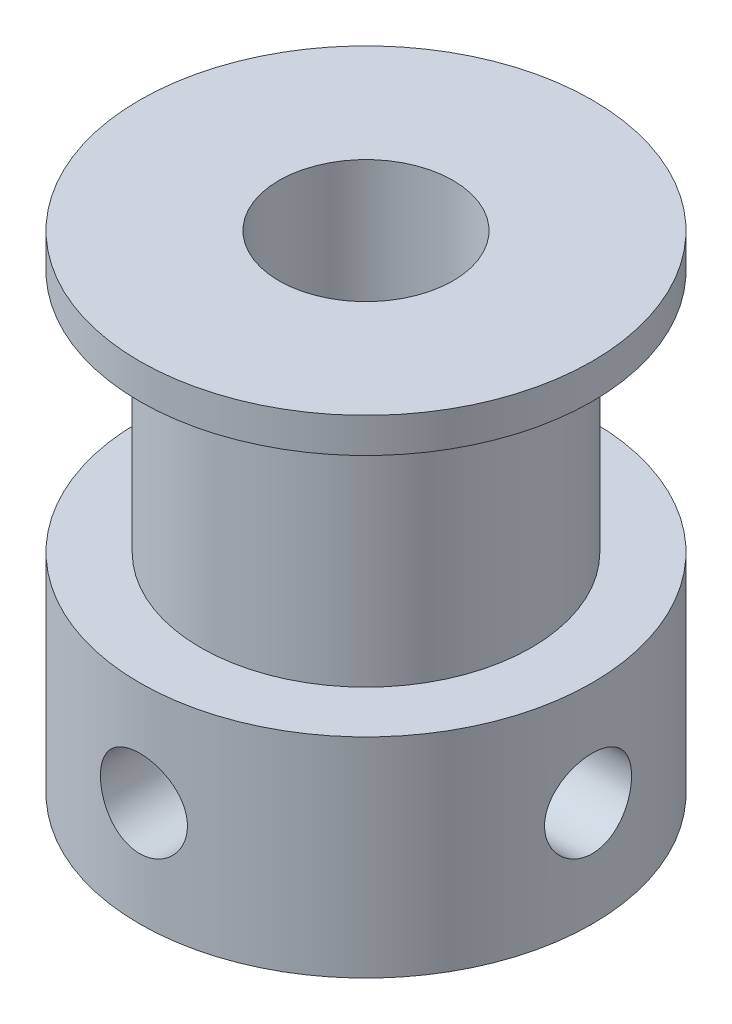
ISO-10303-21;
HEADER;
FILE_DESCRIPTION(('STEP AP214'),'2;1');
FILE_NAME('part.step','',(''),(''),'','','');
FILE_SCHEMA(('AUTOMOTIVE_DESIGN { 1 0 10303 214 1 1 1 1 }'));
ENDSEC;
DATA;
#1=APPLICATION_CONTEXT('core data for automotive mechanical design processes');
#2=APPLICATION_PROTOCOL_DEFINITION('international standard','automotive_design',2000,#1);
#3=PRODUCT_CONTEXT('',#1,'mechanical');
#4=PRODUCT('Part','Part','',(#3));
#5=PRODUCT_RELATED_PRODUCT_CATEGORY('part','',(#4));
#6=PRODUCT_DEFINITION_FORMATION('','',#4);
#7=PRODUCT_DEFINITION_CONTEXT('part definition',#1,'design');
#8=PRODUCT_DEFINITION('design','',#6,#7);
#9=PRODUCT_DEFINITION_SHAPE('','',#8);
#10=(LENGTH_UNIT() NAMED_UNIT(*) SI_UNIT(.MILLI.,.METRE.));
#11=(NAMED_UNIT(*) PLANE_ANGLE_UNIT() SI_UNIT($,.RADIAN.));
#12=(NAMED_UNIT(*) SI_UNIT($,.STERADIAN.) SOLID_ANGLE_UNIT());
#13=UNCERTAINTY_MEASURE_WITH_UNIT(LENGTH_MEASURE(1.E-05),#10,'distance_accuracy_value','');
#14=(GEOMETRIC_REPRESENTATION_CONTEXT(3) GLOBAL_UNCERTAINTY_ASSIGNED_CONTEXT((#13)) GLOBAL_UNIT_ASSIGNED_CONTEXT((#10,
#11,#12)) REPRESENTATION_CONTEXT('',''));
#15=CARTESIAN_POINT('',(0.,0.,0.));
#16=DIRECTION('',(0.,0.,1.));
#17=DIRECTION('',(1.,0.,0.));
#18=AXIS2_PLACEMENT_3D('',#15,#16,#17);
#19=CARTESIAN_POINT('',(0.,0.,0.));
#20=DIRECTION('',(0.,-1.,0.));
#21=DIRECTION('',(0.,0.,-1.));
#22=AXIS2_PLACEMENT_3D('',#19,#20,#21);
#23=CYLINDRICAL_SURFACE('',#22,2.5);
#24=CARTESIAN_POINT('',(2.1650635094611,3.,1.24999999999999));
#25=CARTESIAN_POINT('',(2.16506918410574,3.06513476024406,1.24999545384316));
#26=CARTESIAN_POINT('',(2.16804751484696,3.13035176440631,1.24487496341651));
#27=CARTESIAN_POINT('',(2.17952958065066,3.25878408084644,1.22465401237256));
#28=CARTESIAN_POINT('',(2.1880449256945,3.32199489380426,1.20953258069272));
#29=CARTESIAN_POINT('',(2.20936683256748,3.44431458042992,1.17012493587476));
#30=CARTESIAN_POINT('',(2.22215054341565,3.50344331559198,1.14588744061716));
#31=CARTESIAN_POINT('',(2.25053331021073,3.6167802524959,1.08908440672046));
#32=CARTESIAN_POINT('',(2.26613251845081,3.67098818782807,1.05651841754471));
#33=CARTESIAN_POINT('',(2.29996086321802,3.77788216069688,0.980833175663592));
#34=CARTESIAN_POINT('',(2.31830079547442,3.83007391959193,0.937065045179707));
#35=CARTESIAN_POINT('',(2.35464978482132,3.92676048550838,0.84156725951808));
#36=CARTESIAN_POINT('',(2.37265867289063,3.9712514532294,0.789833657227861));
#37=CARTESIAN_POINT('',(2.40776846191186,4.05420893893457,0.675611954268178));
#38=CARTESIAN_POINT('',(2.42472633022716,4.09206720982441,0.612633986265714));
#39=CARTESIAN_POINT('',(2.45438445124411,4.1564260665572,0.480196283249376));
#40=CARTESIAN_POINT('',(2.46708738979677,4.18293382017146,0.410740672672691));
#41=CARTESIAN_POINT('',(2.48600576555297,4.22188082662637,0.272556179907469));
#42=CARTESIAN_POINT('',(2.49261850276115,4.23518690794441,0.20412723811102));
#43=CARTESIAN_POINT('',(2.50009479807584,4.25020764834379,0.065713285872309));
#44=CARTESIAN_POINT('',(2.50096183480737,4.25192932099463,-0.00427075730467387));
#45=CARTESIAN_POINT('',(2.49703727395563,4.24406665753706,-0.137290655529687));
#46=CARTESIAN_POINT('',(2.49273119865201,4.23545248059847,-0.200401498970989));
#47=CARTESIAN_POINT('',(2.47967806574684,4.20889894511917,-0.324142214897902));
#48=CARTESIAN_POINT('',(2.47093067582992,4.19095888877971,-0.384771901367406));
#49=CARTESIAN_POINT('',(2.44964479109568,4.14614679238773,-0.50288673946194));
#50=CARTESIAN_POINT('',(2.43705551911499,4.11915460853491,-0.560316779393971));
#51=CARTESIAN_POINT('',(2.40922057483359,4.05717072974813,-0.669971001891658));
#52=CARTESIAN_POINT('',(2.39397395196855,4.02217617087206,-0.722193311048304));
#53=CARTESIAN_POINT('',(2.36055492999037,3.94138081058372,-0.82521707612274));
#54=CARTESIAN_POINT('',(2.34224219997719,3.89487121459248,-0.875417593786697));
#55=CARTESIAN_POINT('',(2.30567925733515,3.79426284383727,-0.967630462872221));
#56=CARTESIAN_POINT('',(2.28742910332036,3.74015828465742,-1.00963651446778));
#57=CARTESIAN_POINT('',(2.25180195115606,3.62168975946989,-1.08688166830276));
#58=CARTESIAN_POINT('',(2.23455399988385,3.55689247118223,-1.12152164372256));
#59=CARTESIAN_POINT('',(2.2046931284822,3.42132791080125,-1.17914889125153));
#60=CARTESIAN_POINT('',(2.19207537557585,3.35056695872804,-1.20214832276361));
#61=CARTESIAN_POINT('',(2.17430794771293,3.21098186089651,-1.23397526378129));
#62=CARTESIAN_POINT('',(2.16864569810621,3.14244860119556,-1.24378140264996));
#63=CARTESIAN_POINT('',(2.16397399202012,3.00449832310432,-1.25189618326428));
#64=CARTESIAN_POINT('',(2.1649598361164,2.93508196360026,-1.25021294664377));
#65=CARTESIAN_POINT('',(2.17292920675732,2.80543260177659,-1.23629505417995));
#66=CARTESIAN_POINT('',(2.17924484383318,2.74502568611509,-1.22523477089058));
#67=CARTESIAN_POINT('',(2.19617526939177,2.6270402671613,-1.19462035579054));
#68=CARTESIAN_POINT('',(2.20679145006293,2.56946268656674,-1.17506347327951));
#69=CARTESIAN_POINT('',(2.23170277599571,2.45573583637163,-1.1270594857561));
#70=CARTESIAN_POINT('',(2.24614554053829,2.39977622893306,-1.0982425796159));
#71=CARTESIAN_POINT('',(2.27695149371562,2.29316341057626,-1.03285883001975));
#72=CARTESIAN_POINT('',(2.29331566693935,2.2425129456084,-0.996288005415263));
#73=CARTESIAN_POINT('',(2.3285999807042,2.14127654059557,-0.91104645899856));
#74=CARTESIAN_POINT('',(2.34758228942862,2.09150356160293,-0.861431590393701));
#75=CARTESIAN_POINT('',(2.38417793722366,2.00073470250802,-0.754255619247854));
#76=CARTESIAN_POINT('',(2.40179081259637,1.95974178721183,-0.696691843319177));
#77=CARTESIAN_POINT('',(2.43426702113696,1.88678284256238,-0.57316920319844));
#78=CARTESIAN_POINT('',(2.44904552090037,1.85508360223637,-0.507028871967635));
#79=CARTESIAN_POINT('',(2.47354193699126,1.80357762017827,-0.369402955801347));
#80=CARTESIAN_POINT('',(2.48326429595466,1.78376043579213,-0.297922126740215));
#81=CARTESIAN_POINT('',(2.49584385227353,1.75828929478168,-0.158724602913017));
#82=CARTESIAN_POINT('',(2.49924909885239,1.75150265515486,-0.0912643048130678));
#83=CARTESIAN_POINT('',(2.50052662968914,1.74894591818201,0.0439074824390071));
#84=CARTESIAN_POINT('',(2.49840085083612,1.75317196434555,0.111618875368861));
#85=CARTESIAN_POINT('',(2.48917461047403,1.77177050849454,0.240672490396435));
#86=CARTESIAN_POINT('',(2.48241118334987,1.7854560615721,0.302140397264081));
#87=CARTESIAN_POINT('',(2.46490117079279,1.82165874912872,0.421807440229522));
#88=CARTESIAN_POINT('',(2.45415401415995,1.84417715011682,0.480006106194386));
#89=CARTESIAN_POINT('',(2.4290741343515,1.89840881520747,0.594279257806105));
#90=CARTESIAN_POINT('',(2.41460771498499,1.93047415400981,0.650156428375057));
#91=CARTESIAN_POINT('',(2.38360166427283,2.00244741357382,0.75596830226753));
#92=CARTESIAN_POINT('',(2.36706108197951,2.0423589363946,0.805900259268632));
#93=CARTESIAN_POINT('',(2.33160762783285,2.13349642377839,0.903642505196112));
#94=CARTESIAN_POINT('',(2.31262248764623,2.1854531093465,0.950747105674087));
#95=CARTESIAN_POINT('',(2.27578845203566,2.29681340141222,1.03582910924334));
#96=CARTESIAN_POINT('',(2.25794057202332,2.35622352608461,1.07379843751257));
#97=CARTESIAN_POINT('',(2.22499506631145,2.4832958082262,1.14053884973206));
#98=CARTESIAN_POINT('',(2.21000217820338,2.55115941391093,1.16898133245117));
#99=CARTESIAN_POINT('',(2.1858269541044,2.69166550542473,1.21359838688301));
#100=CARTESIAN_POINT('',(2.17662520184628,2.76429111114086,1.22981398896918));
#101=CARTESIAN_POINT('',(2.16911590752239,2.864756694565,1.24295875983051));
#102=CARTESIAN_POINT('',(2.1676016125644,2.89170986799736,1.24559513120481));
#103=CARTESIAN_POINT('',(2.16557419859688,2.94577060085281,1.24911675636245));
#104=CARTESIAN_POINT('',(2.16506114656387,2.97287817048234,1.25000189299983));
#105=CARTESIAN_POINT('',(2.1650635094611,3.,1.24999999999999));
#106=B_SPLINE_CURVE_WITH_KNOTS('',3,(#24,#25,#26,#27,#28,#29,#30,#31,#32,#33,#34,#35,#36,#37,
#38,#39,#40,#41,#42,#43,#44,#45,#46,#47,#48,#49,#50,#51,#52,#53,#54,#55,#56,#57,#58,#59,#60,#61,
#62,#63,#64,#65,#66,#67,#68,#69,#70,#71,#72,#73,#74,#75,#76,#77,#78,#79,#80,#81,#82,#83,#84,#85,
#86,#87,#88,#89,#90,#91,#92,#93,#94,#95,#96,#97,#98,#99,#100,#101,#102,#103,#104,#105),
.UNSPECIFIED.,.T.,.F.,(4,2,2,2,2,2,2,2,2,2,2,2,2,2,2,2,2,2,2,2,2,2,2,2,2,2,2,2,2,2,2,2,2,2,2,2,
2,2,2,2,4),(0.,0.195290153243393,0.390991116031004,0.585660744898605,0.780340906806434,
0.991077890622787,1.20191963855463,1.42697365298454,1.65188533704863,1.86079356209918,
2.06957529607549,2.26020121855672,2.45084140646818,2.64411918413932,2.83746624187838,
3.04908989321112,3.26087560307396,3.48611052161809,3.71110967764629,3.91827863567763,
4.12530116485464,4.30967729280029,4.49411315545076,4.68709120507607,4.88016857775056,
5.09758429475764,5.3150733122275,5.53830226766204,5.76133474760961,5.96390337986855,
6.16640108492461,6.35555531089362,6.54473666890012,6.74200938399336,6.93937287625895,
7.1563780231258,7.37357428556439,7.59763436298252,7.82093916253446,7.90225168981632,
7.98356965618171),.UNSPECIFIED.);
#107=CARTESIAN_POINT('',(2.1650635094611,3.,1.24999999999999));
#108=VERTEX_POINT('',#107);
#109=EDGE_CURVE('E83',#108,#108,#106,.T.);
#110=ORIENTED_EDGE('',*,*,#109,.F.);
#111=EDGE_LOOP('',(#110));
#112=FACE_BOUND('',#111,.T.);
#113=CARTESIAN_POINT('',(-1.25,3.,2.1650635094611));
#114=CARTESIAN_POINT('',(-1.24999545384316,3.06513476024406,2.16506918410574));
#115=CARTESIAN_POINT('',(-1.24487496341652,3.13035176440631,2.16804751484696));
#116=CARTESIAN_POINT('',(-1.22465401237257,3.25878408084644,2.17952958065066));
#117=CARTESIAN_POINT('',(-1.20953258069272,3.32199489380426,2.18804492569449));
#118=CARTESIAN_POINT('',(-1.17012493587476,3.44431458042993,2.20936683256748));
#119=CARTESIAN_POINT('',(-1.14588744061716,3.50344331559198,2.22215054341565));
#120=CARTESIAN_POINT('',(-1.08908440672046,3.6167802524959,2.25053331021072));
#121=CARTESIAN_POINT('',(-1.05651841754472,3.67098818782807,2.26613251845081));
#122=CARTESIAN_POINT('',(-0.980833175663597,3.77788216069688,2.29996086321802));
#123=CARTESIAN_POINT('',(-0.937065045179712,3.83007391959193,2.31830079547442));
#124=CARTESIAN_POINT('',(-0.841567259518084,3.92676048550839,2.35464978482132));
#125=CARTESIAN_POINT('',(-0.789833657227865,3.9712514532294,2.37265867289062));
#126=CARTESIAN_POINT('',(-0.675611954268182,4.05420893893458,2.40776846191186));
#127=CARTESIAN_POINT('',(-0.612633986265718,4.09206720982441,2.42472633022716));
#128=CARTESIAN_POINT('',(-0.48019628324938,4.1564260665572,2.45438445124411));
#129=CARTESIAN_POINT('',(-0.410740672672693,4.18293382017146,2.46708738979677));
#130=CARTESIAN_POINT('',(-0.272556179907471,4.22188082662637,2.48600576555297));
#131=CARTESIAN_POINT('',(-0.204127238111021,4.23518690794442,2.49261850276115));
#132=CARTESIAN_POINT('',(-0.06571328587231,4.2502076483438,2.50009479807584));
#133=CARTESIAN_POINT('',(0.00427075730467308,4.25192932099464,2.50096183480737));
#134=CARTESIAN_POINT('',(0.137290655529687,4.24406665753706,2.49703727395563));
#135=CARTESIAN_POINT('',(0.200401498970989,4.23545248059847,2.49273119865201));
#136=CARTESIAN_POINT('',(0.324142214897902,4.20889894511918,2.47967806574684));
#137=CARTESIAN_POINT('',(0.384771901367406,4.19095888877972,2.47093067582992));
#138=CARTESIAN_POINT('',(0.502886739461941,4.14614679238773,2.44964479109568));
#139=CARTESIAN_POINT('',(0.560316779393972,4.11915460853491,2.43705551911499));
#140=CARTESIAN_POINT('',(0.66997100189166,4.05717072974813,2.40922057483359));
#141=CARTESIAN_POINT('',(0.722193311048306,4.02217617087206,2.39397395196855));
#142=CARTESIAN_POINT('',(0.825217076122743,3.94138081058373,2.36055492999037));
#143=CARTESIAN_POINT('',(0.8754175937867,3.89487121459249,2.34224219997719));
#144=CARTESIAN_POINT('',(0.967630462872224,3.79426284383728,2.30567925733515));
#145=CARTESIAN_POINT('',(1.00963651446779,3.74015828465742,2.28742910332036));
#146=CARTESIAN_POINT('',(1.08688166830276,3.62168975946989,2.25180195115606));
#147=CARTESIAN_POINT('',(1.12152164372256,3.55689247118224,2.23455399988385));
#148=CARTESIAN_POINT('',(1.17914889125154,3.42132791080125,2.2046931284822));
#149=CARTESIAN_POINT('',(1.20214832276361,3.35056695872805,2.19207537557584));
#150=CARTESIAN_POINT('',(1.2339752637813,3.21098186089651,2.17430794771293));
#151=CARTESIAN_POINT('',(1.24378140264997,3.14244860119556,2.16864569810621));
#152=CARTESIAN_POINT('',(1.25189618326428,3.00449832310432,2.16397399202012));
#153=CARTESIAN_POINT('',(1.25021294664378,2.93508196360027,2.1649598361164));
#154=CARTESIAN_POINT('',(1.23629505417996,2.80543260177659,2.17292920675731));
#155=CARTESIAN_POINT('',(1.22523477089058,2.74502568611509,2.17924484383318));
#156=CARTESIAN_POINT('',(1.19462035579055,2.6270402671613,2.19617526939176));
#157=CARTESIAN_POINT('',(1.17506347327952,2.56946268656674,2.20679145006292));
#158=CARTESIAN_POINT('',(1.12705948575611,2.45573583637163,2.23170277599571));
#159=CARTESIAN_POINT('',(1.0982425796159,2.39977622893306,2.24614554053829));
#160=CARTESIAN_POINT('',(1.03285883001975,2.29316341057626,2.27695149371562));
#161=CARTESIAN_POINT('',(0.996288005415269,2.2425129456084,2.29331566693935));
#162=CARTESIAN_POINT('',(0.911046458998566,2.14127654059557,2.3285999807042));
#163=CARTESIAN_POINT('',(0.861431590393707,2.09150356160293,2.34758228942861));
#164=CARTESIAN_POINT('',(0.75425561924786,2.00073470250801,2.38417793722366));
#165=CARTESIAN_POINT('',(0.696691843319183,1.95974178721183,2.40179081259637));
#166=CARTESIAN_POINT('',(0.573169203198446,1.88678284256237,2.43426702113696));
#167=CARTESIAN_POINT('',(0.507028871967641,1.85508360223636,2.44904552090037));
#168=CARTESIAN_POINT('',(0.369402955801352,1.80357762017826,2.47354193699126));
#169=CARTESIAN_POINT('',(0.297922126740219,1.78376043579212,2.48326429595466));
#170=CARTESIAN_POINT('',(0.158724602913021,1.75828929478167,2.49584385227353));
#171=CARTESIAN_POINT('',(0.0912643048130706,1.75150265515486,2.49924909885239));
#172=CARTESIAN_POINT('',(-0.043907482439005,1.748945918182,2.50052662968914));
#173=CARTESIAN_POINT('',(-0.111618875368859,1.75317196434555,2.49840085083612));
#174=CARTESIAN_POINT('',(-0.240672490396434,1.77177050849453,2.48917461047403));
#175=CARTESIAN_POINT('',(-0.30214039726408,1.78545606157209,2.48241118334987));
#176=CARTESIAN_POINT('',(-0.421807440229522,1.82165874912872,2.46490117079279));
#177=CARTESIAN_POINT('',(-0.480006106194386,1.84417715011682,2.45415401415995));
#178=CARTESIAN_POINT('',(-0.594279257806106,1.89840881520747,2.4290741343515));
#179=CARTESIAN_POINT('',(-0.650156428375057,1.9304741540098,2.41460771498499));
#180=CARTESIAN_POINT('',(-0.75596830226753,2.00244741357381,2.38360166427283));
#181=CARTESIAN_POINT('',(-0.805900259268633,2.04235893639459,2.36706108197951));
#182=CARTESIAN_POINT('',(-0.903642505196114,2.13349642377838,2.33160762783285));
#183=CARTESIAN_POINT('',(-0.950747105674089,2.18545310934649,2.31262248764622));
#184=CARTESIAN_POINT('',(-1.03582910924334,2.29681340141221,2.27578845203566));
#185=CARTESIAN_POINT('',(-1.07379843751257,2.35622352608461,2.25794057202332));
#186=CARTESIAN_POINT('',(-1.14053884973207,2.4832958082262,2.22499506631145));
#187=CARTESIAN_POINT('',(-1.16898133245117,2.55115941391092,2.21000217820338));
#188=CARTESIAN_POINT('',(-1.21359838688301,2.69166550542472,2.1858269541044));
#189=CARTESIAN_POINT('',(-1.22981398896918,2.76429111114086,2.17662520184628));
#190=CARTESIAN_POINT('',(-1.24295875983052,2.864756694565,2.16911590752238));
#191=CARTESIAN_POINT('',(-1.24559513120481,2.89170986799735,2.1676016125644));
#192=CARTESIAN_POINT('',(-1.24911675636245,2.9457706008528,2.16557419859688));
#193=CARTESIAN_POINT('',(-1.25000189299984,2.97287817048234,2.16506114656387));
#194=CARTESIAN_POINT('',(-1.25,3.,2.1650635094611));
#195=B_SPLINE_CURVE_WITH_KNOTS('',3,(#113,#114,#115,#116,#117,#118,#119,#120,#121,#122,#123,
#124,#125,#126,#127,#128,#129,#130,#131,#132,#133,#134,#135,#136,#137,#138,#139,#140,#141,#142,
#143,#144,#145,#146,#147,#148,#149,#150,#151,#152,#153,#154,#155,#156,#157,#158,#159,#160,#161,
#162,#163,#164,#165,#166,#167,#168,#169,#170,#171,#172,#173,#174,#175,#176,#177,#178,#179,#180,
#181,#182,#183,#184,#185,#186,#187,#188,#189,#190,#191,#192,#193,#194),.UNSPECIFIED.,.T.,.F.,(4,
2,2,2,2,2,2,2,2,2,2,2,2,2,2,2,2,2,2,2,2,2,2,2,2,2,2,2,2,2,2,2,2,2,2,2,2,2,2,2,4),(0.,
0.195290153243394,0.390991116031005,0.585660744898607,0.780340906806436,0.991077890622791,
1.20191963855464,1.42697365298454,1.65188533704864,1.86079356209919,2.0695752960755,
2.26020121855673,2.45084140646819,2.64411918413933,2.8374662418784,3.04908989321113,
3.26087560307398,3.4861105216181,3.71110967764631,3.91827863567764,4.12530116485466,
4.30967729280031,4.49411315545078,4.68709120507609,4.88016857775059,5.09758429475766,
5.31507331222752,5.53830226766207,5.76133474760964,5.96390337986858,6.16640108492464,
6.35555531089365,6.54473666890016,6.74200938399339,6.93937287625898,7.15637802312583,
7.37357428556442,7.59763436298255,7.8209391625345,7.90225168981636,7.98356965618175),.UNSPECIFIED.);
#196=CARTESIAN_POINT('',(-1.25,3.,2.1650635094611));
#197=VERTEX_POINT('',#196);
#198=EDGE_CURVE('E75',#197,#197,#195,.T.);
#199=ORIENTED_EDGE('',*,*,#198,.F.);
#200=EDGE_LOOP('',(#199));
#201=FACE_BOUND('',#200,.T.);
#202=CARTESIAN_POINT('',(0.,0.,0.));
#203=DIRECTION('',(0.,-1.,0.));
#204=DIRECTION('',(0.,0.,-1.));
#205=AXIS2_PLACEMENT_3D('',#202,#203,#204);
#206=CIRCLE('',#205,2.5);
#207=CARTESIAN_POINT('',(0.,0.,-2.5));
#208=VERTEX_POINT('',#207);
#209=EDGE_CURVE('E50',#208,#208,#206,.T.);
#210=ORIENTED_EDGE('',*,*,#209,.T.);
#211=EDGE_LOOP('',(#210));
#212=FACE_BOUND('',#211,.T.);
#213=CARTESIAN_POINT('',(0.,14.,0.));
#214=DIRECTION('',(0.,-1.,0.));
#215=DIRECTION('',(0.,0.,-1.));
#216=AXIS2_PLACEMENT_3D('',#213,#214,#215);
#217=CIRCLE('',#216,2.5);
#218=CARTESIAN_POINT('',(0.,14.,-2.5));
#219=VERTEX_POINT('',#218);
#220=EDGE_CURVE('E82',#219,#219,#217,.T.);
#221=ORIENTED_EDGE('',*,*,#220,.F.);
#222=EDGE_LOOP('',(#221));
#223=FACE_BOUND('',#222,.T.);
#224=ADVANCED_FACE('F34',(#112,#201,#212,#223),#23,.F.);
#225=CARTESIAN_POINT('',(2.5,0.,0.));
#226=DIRECTION('',(0.,-1.,0.));
#227=DIRECTION('',(0.,0.,-1.));
#228=AXIS2_PLACEMENT_3D('',#225,#226,#227);
#229=PLANE('',#228);
#230=CARTESIAN_POINT('',(0.,0.,0.));
#231=DIRECTION('',(0.,-1.,0.));
#232=DIRECTION('',(0.,0.,-1.));
#233=AXIS2_PLACEMENT_3D('',#230,#231,#232);
#234=CIRCLE('',#233,6.5);
#235=CARTESIAN_POINT('',(0.,0.,-6.5));
#236=VERTEX_POINT('',#235);
#237=EDGE_CURVE('E54',#236,#236,#234,.T.);
#238=ORIENTED_EDGE('',*,*,#237,.T.);
#239=EDGE_LOOP('',(#238));
#240=FACE_BOUND('',#239,.T.);
#241=ORIENTED_EDGE('',*,*,#209,.F.);
#242=EDGE_LOOP('',(#241));
#243=FACE_BOUND('',#242,.T.);
#244=ADVANCED_FACE('F106',(#240,#243),#229,.T.);
#245=CARTESIAN_POINT('',(0.,0.,0.));
#246=DIRECTION('',(0.,-1.,0.));
#247=DIRECTION('',(0.,0.,-1.));
#248=AXIS2_PLACEMENT_3D('',#245,#246,#247);
#249=CYLINDRICAL_SURFACE('',#248,6.5);
#250=CARTESIAN_POINT('',(6.5,1.75000000000001,0.));
#251=CARTESIAN_POINT('',(6.49999873054918,1.75000262060986,-0.0695263300903764));
#252=CARTESIAN_POINT('',(6.49887299034978,1.755820293649,-0.139086386536077));
#253=CARTESIAN_POINT('',(6.49449072478032,1.77892097243112,-0.276244066545679));
#254=CARTESIAN_POINT('',(6.49123244093525,1.79621344034302,-0.343840022447297));
#255=CARTESIAN_POINT('',(6.48294932466696,1.84171279024408,-0.475066268731183));
#256=CARTESIAN_POINT('',(6.47792612463065,1.86990958913683,-0.538700159856864));
#257=CARTESIAN_POINT('',(6.46666077439192,1.93638806396314,-0.660328619211788));
#258=CARTESIAN_POINT('',(6.46041871297687,1.97466900539309,-0.718323597744217));
#259=CARTESIAN_POINT('',(6.44731615012176,2.0607395828539,-0.827762164871105));
#260=CARTESIAN_POINT('',(6.44044947743084,2.10863141572556,-0.879124647683765));
#261=CARTESIAN_POINT('',(6.42691706808667,2.21234451859734,-0.973138343078078));
#262=CARTESIAN_POINT('',(6.42025134636388,2.26816637603829,-1.01578890972675));
#263=CARTESIAN_POINT('',(6.40781547009761,2.3867319976789,-1.0915083981031));
#264=CARTESIAN_POINT('',(6.40205326632547,2.44952971555017,-1.12449425725112));
#265=CARTESIAN_POINT('',(6.39216406280365,2.57990495501329,-1.17941610157593));
#266=CARTESIAN_POINT('',(6.38803691434868,2.64748204127121,-1.20135309167638));
#267=CARTESIAN_POINT('',(6.38194735063818,2.78462809585959,-1.23329305228568));
#268=CARTESIAN_POINT('',(6.37995924110286,2.85416288334854,-1.2434377939577));
#269=CARTESIAN_POINT('',(6.37829543879724,2.99397381845999,-1.2519454509238));
#270=CARTESIAN_POINT('',(6.3786195277321,3.06424989547179,-1.25030947843595));
#271=CARTESIAN_POINT('',(6.38152012920898,3.20251761158103,-1.23541697804276));
#272=CARTESIAN_POINT('',(6.38406529733108,3.27052742238238,-1.22232215325026));
#273=CARTESIAN_POINT('',(6.39107200195107,3.40336649155779,-1.18513854067888));
#274=CARTESIAN_POINT('',(6.39553362370363,3.46819560829362,-1.16104926380165));
#275=CARTESIAN_POINT('',(6.40590301761788,3.59330347190975,-1.10240382729655));
#276=CARTESIAN_POINT('',(6.41181970353635,3.653551055254,-1.06778282798613));
#277=CARTESIAN_POINT('',(6.42442673553149,3.76744248556928,-0.989102525446732));
#278=CARTESIAN_POINT('',(6.43111716402495,3.82108562779584,-0.945042216343227));
#279=CARTESIAN_POINT('',(6.44465411904849,3.9211792671104,-0.847864455663334));
#280=CARTESIAN_POINT('',(6.45150139326972,3.9674955950184,-0.79460880577996));
#281=CARTESIAN_POINT('',(6.46447860514488,4.05055775365026,-0.681013328076989));
#282=CARTESIAN_POINT('',(6.47060853487937,4.08730347872057,-0.620673422062235));
#283=CARTESIAN_POINT('',(6.48147374305158,4.15020302351982,-0.494478881244394));
#284=CARTESIAN_POINT('',(6.48620711303174,4.17634236730858,-0.428616856521531));
#285=CARTESIAN_POINT('',(6.49373123608211,4.21714871167345,-0.293325284598555));
#286=CARTESIAN_POINT('',(6.4965222064135,4.2318169953326,-0.223896137321167));
#287=CARTESIAN_POINT('',(6.4998170641524,4.24907688307678,-0.0845949575723073));
#288=CARTESIAN_POINT('',(6.50035574677271,4.25185223592052,-0.0147464889976585));
#289=CARTESIAN_POINT('',(6.49918164994221,4.24574111140167,0.124416318296412));
#290=CARTESIAN_POINT('',(6.497468987103,4.23685523804882,0.193730684493375));
#291=CARTESIAN_POINT('',(6.49200634359786,4.20782662800248,0.32927112129011));
#292=CARTESIAN_POINT('',(6.48827328656802,4.18777736078712,0.395517951862496));
#293=CARTESIAN_POINT('',(6.47918677244288,4.13709260993777,0.523709778000946));
#294=CARTESIAN_POINT('',(6.47383320094063,4.10645637885136,0.585654469459847));
#295=CARTESIAN_POINT('',(6.4620127326735,4.03506412841262,0.704264341336225));
#296=CARTESIAN_POINT('',(6.4555338112679,3.9941964542316,0.760861092631652));
#297=CARTESIAN_POINT('',(6.44221127589378,3.90365188825132,0.866459302715512));
#298=CARTESIAN_POINT('',(6.43536762602225,3.85397412808301,0.91546001190446));
#299=CARTESIAN_POINT('',(6.42197081919612,3.74638591930198,1.00517755082431));
#300=CARTESIAN_POINT('',(6.41542307578637,3.68836987485851,1.04576869619256));
#301=CARTESIAN_POINT('',(6.40347051879715,3.56623483786333,1.11662974416658));
#302=CARTESIAN_POINT('',(6.39806566143698,3.50211607922572,1.14690004216186));
#303=CARTESIAN_POINT('',(6.38905378658871,3.36990682052688,1.19608442093858));
#304=CARTESIAN_POINT('',(6.38543785792601,3.30183793326623,1.21505488797638));
#305=CARTESIAN_POINT('',(6.38039343660705,3.16340246339675,1.24127395271722));
#306=CARTESIAN_POINT('',(6.37896468278173,3.0930361561463,1.24852394995944));
#307=CARTESIAN_POINT('',(6.37847010253234,2.95326332203922,1.25104755843673));
#308=CARTESIAN_POINT('',(6.37936513521924,2.88386043851629,1.24651955106103));
#309=CARTESIAN_POINT('',(6.3833302398308,2.7468250277468,1.2260513326902));
#310=CARTESIAN_POINT('',(6.38640029712568,2.67919248859562,1.21011119845592));
#311=CARTESIAN_POINT('',(6.39435266298136,2.547731690079,1.16735673858749));
#312=CARTESIAN_POINT('',(6.39923121033494,2.48389585204118,1.14056497100193));
#313=CARTESIAN_POINT('',(6.4102533266987,2.36159381905454,1.07688985392763));
#314=CARTESIAN_POINT('',(6.41639699144119,2.30312803094554,1.04000574067458));
#315=CARTESIAN_POINT('',(6.42937795151368,2.19223421265769,0.956507819072137));
#316=CARTESIAN_POINT('',(6.43622463982555,2.13991565925893,0.909750049269221));
#317=CARTESIAN_POINT('',(6.44977101580728,2.04380131225286,0.808131192425038));
#318=CARTESIAN_POINT('',(6.45647066935191,2.00000747896596,0.753268246630369));
#319=CARTESIAN_POINT('',(6.46904328529454,1.92179349157222,0.636368128673312));
#320=CARTESIAN_POINT('',(6.47490774506217,1.88746681496544,0.574267467434705));
#321=CARTESIAN_POINT('',(6.48506595383496,1.82978960381797,0.445086129675204));
#322=CARTESIAN_POINT('',(6.48936115496814,1.80642891606555,0.378010126647425));
#323=CARTESIAN_POINT('',(6.49503671875109,1.77600770789271,0.25896178285277));
#324=CARTESIAN_POINT('',(6.49688729501668,1.76627175512384,0.207678719850836));
#325=CARTESIAN_POINT('',(6.49936939476943,1.75326700818149,0.104270079257341));
#326=CARTESIAN_POINT('',(6.50000095208405,1.749998034551,0.0521445250851628));
#327=CARTESIAN_POINT('',(6.5,1.75000000000001,0.));
#328=B_SPLINE_CURVE_WITH_KNOTS('',3,(#250,#251,#252,#253,#254,#255,#256,#257,#258,#259,#260,
#261,#262,#263,#264,#265,#266,#267,#268,#269,#270,#271,#272,#273,#274,#275,#276,#277,#278,#279,
#280,#281,#282,#283,#284,#285,#286,#287,#288,#289,#290,#291,#292,#293,#294,#295,#296,#297,#298,
#299,#300,#301,#302,#303,#304,#305,#306,#307,#308,#309,#310,#311,#312,#313,#314,#315,#316,#317,
#318,#319,#320,#321,#322,#323,#324,#325,#326,#327),.UNSPECIFIED.,.T.,.F.,(4,2,2,2,2,2,2,2,2,2,2,
2,2,2,2,2,2,2,2,2,2,2,2,2,2,2,2,2,2,2,2,2,2,2,2,2,2,2,4),(0.,0.208388270286284,
0.416948592398256,0.625316520786642,0.833669276372906,1.04436766202049,1.25508166394261,
1.4675568091212,1.68001262563573,1.88988689492413,2.09974135022728,2.30668132349719,
2.51363050358033,2.72188049935152,2.93015269776839,3.14188196787825,3.35361357524976,
3.5656331967002,3.77762909953163,3.98633752849763,4.19503514754153,4.4020110924708,
4.60900165313824,4.81835785477025,5.02773470314617,5.24004512383248,5.45234741003692,
5.66358123272485,5.87478983015676,6.0824640856177,6.29013694422219,6.49738029642492,
6.70463933664284,6.91515952159821,7.12572806013488,7.33830680136688,7.5506883296536,
7.7069832027341,7.86327373861125),.UNSPECIFIED.);
#329=CARTESIAN_POINT('',(6.5,1.75000000000001,0.));
#330=VERTEX_POINT('',#329);
#331=EDGE_CURVE('E10',#330,#330,#328,.T.);
#332=ORIENTED_EDGE('',*,*,#331,.F.);
#333=EDGE_LOOP('',(#332));
#334=FACE_BOUND('',#333,.T.);
#335=CARTESIAN_POINT('',(0.,1.75,6.5));
#336=CARTESIAN_POINT('',(0.0695263300903767,1.75000262060986,6.49999873054918));
#337=CARTESIAN_POINT('',(0.139086386536077,1.755820293649,6.49887299034978));
#338=CARTESIAN_POINT('',(0.27624406654568,1.77892097243111,6.49449072478032));
#339=CARTESIAN_POINT('',(0.343840022447299,1.79621344034301,6.49123244093525));
#340=CARTESIAN_POINT('',(0.475066268731185,1.84171279024407,6.48294932466696));
#341=CARTESIAN_POINT('',(0.538700159856867,1.86990958913682,6.47792612463065));
#342=CARTESIAN_POINT('',(0.660328619211791,1.93638806396314,6.46666077439192));
#343=CARTESIAN_POINT('',(0.718323597744221,1.97466900539309,6.46041871297687));
#344=CARTESIAN_POINT('',(0.827762164871109,2.06073958285389,6.44731615012176));
#345=CARTESIAN_POINT('',(0.879124647683768,2.10863141572555,6.44044947743084));
#346=CARTESIAN_POINT('',(0.973138343078081,2.21234451859733,6.42691706808667));
#347=CARTESIAN_POINT('',(1.01578890972676,2.26816637603829,6.42025134636388));
#348=CARTESIAN_POINT('',(1.09150839810311,2.3867319976789,6.4078154700976));
#349=CARTESIAN_POINT('',(1.12449425725113,2.44952971555017,6.40205326632547));
#350=CARTESIAN_POINT('',(1.17941610157593,2.57990495501328,6.39216406280365));
#351=CARTESIAN_POINT('',(1.20135309167639,2.64748204127121,6.38803691434868));
#352=CARTESIAN_POINT('',(1.23329305228569,2.78462809585959,6.38194735063818));
#353=CARTESIAN_POINT('',(1.24343779395771,2.85416288334854,6.37995924110286));
#354=CARTESIAN_POINT('',(1.2519454509238,2.99397381845999,6.37829543879724));
#355=CARTESIAN_POINT('',(1.25030947843596,3.06424989547179,6.3786195277321));
#356=CARTESIAN_POINT('',(1.23541697804277,3.20251761158103,6.38152012920898));
#357=CARTESIAN_POINT('',(1.22232215325027,3.27052742238238,6.38406529733108));
#358=CARTESIAN_POINT('',(1.18513854067889,3.40336649155779,6.39107200195106));
#359=CARTESIAN_POINT('',(1.16104926380165,3.46819560829363,6.39553362370363));
#360=CARTESIAN_POINT('',(1.10240382729656,3.59330347190975,6.40590301761788));
#361=CARTESIAN_POINT('',(1.06778282798614,3.653551055254,6.41181970353635));
#362=CARTESIAN_POINT('',(0.989102525446736,3.76744248556928,6.42442673553149));
#363=CARTESIAN_POINT('',(0.945042216343232,3.82108562779584,6.43111716402495));
#364=CARTESIAN_POINT('',(0.847864455663338,3.92117926711041,6.44465411904849));
#365=CARTESIAN_POINT('',(0.794608805779964,3.9674955950184,6.45150139326972));
#366=CARTESIAN_POINT('',(0.681013328076993,4.05055775365026,6.46447860514488));
#367=CARTESIAN_POINT('',(0.620673422062239,4.08730347872057,6.47060853487937));
#368=CARTESIAN_POINT('',(0.494478881244397,4.15020302351983,6.48147374305158));
#369=CARTESIAN_POINT('',(0.428616856521534,4.17634236730858,6.48620711303174));
#370=CARTESIAN_POINT('',(0.293325284598557,4.21714871167345,6.49373123608211));
#371=CARTESIAN_POINT('',(0.223896137321169,4.2318169953326,6.4965222064135));
#372=CARTESIAN_POINT('',(0.0845949575723078,4.24907688307679,6.4998170641524));
#373=CARTESIAN_POINT('',(0.0147464889976589,4.25185223592052,6.50035574677271));
#374=CARTESIAN_POINT('',(-0.124416318296412,4.24574111140168,6.49918164994221));
#375=CARTESIAN_POINT('',(-0.193730684493375,4.23685523804883,6.497468987103));
#376=CARTESIAN_POINT('',(-0.329271121290111,4.20782662800248,6.49200634359786));
#377=CARTESIAN_POINT('',(-0.395517951862496,4.18777736078712,6.48827328656802));
#378=CARTESIAN_POINT('',(-0.523709778000947,4.13709260993778,6.47918677244289));
#379=CARTESIAN_POINT('',(-0.585654469459849,4.10645637885136,6.47383320094063));
#380=CARTESIAN_POINT('',(-0.704264341336227,4.03506412841263,6.4620127326735));
#381=CARTESIAN_POINT('',(-0.760861092631654,3.9941964542316,6.4555338112679));
#382=CARTESIAN_POINT('',(-0.866459302715515,3.90365188825132,6.44221127589378));
#383=CARTESIAN_POINT('',(-0.915460011904463,3.85397412808302,6.43536762602225));
#384=CARTESIAN_POINT('',(-1.00517755082431,3.74638591930198,6.42197081919612));
#385=CARTESIAN_POINT('',(-1.04576869619256,3.68836987485852,6.41542307578637));
#386=CARTESIAN_POINT('',(-1.11662974416659,3.56623483786333,6.40347051879715));
#387=CARTESIAN_POINT('',(-1.14690004216186,3.50211607922572,6.39806566143697));
#388=CARTESIAN_POINT('',(-1.19608442093859,3.36990682052689,6.3890537865887));
#389=CARTESIAN_POINT('',(-1.21505488797639,3.30183793326623,6.385437857926));
#390=CARTESIAN_POINT('',(-1.24127395271723,3.16340246339675,6.38039343660705));
#391=CARTESIAN_POINT('',(-1.24852394995944,3.0930361561463,6.37896468278173));
#392=CARTESIAN_POINT('',(-1.25104755843674,2.95326332203922,6.37847010253234));
#393=CARTESIAN_POINT('',(-1.24651955106104,2.88386043851629,6.37936513521924));
#394=CARTESIAN_POINT('',(-1.2260513326902,2.7468250277468,6.38333023983079));
#395=CARTESIAN_POINT('',(-1.21011119845593,2.67919248859562,6.38640029712568));
#396=CARTESIAN_POINT('',(-1.16735673858749,2.547731690079,6.39435266298136));
#397=CARTESIAN_POINT('',(-1.14056497100194,2.48389585204118,6.39923121033494));
#398=CARTESIAN_POINT('',(-1.07688985392764,2.36159381905454,6.4102533266987));
#399=CARTESIAN_POINT('',(-1.04000574067459,2.30312803094554,6.41639699144119));
#400=CARTESIAN_POINT('',(-0.956507819072142,2.19223421265769,6.42937795151367));
#401=CARTESIAN_POINT('',(-0.909750049269226,2.13991565925893,6.43622463982555));
#402=CARTESIAN_POINT('',(-0.808131192425043,2.04380131225285,6.44977101580728));
#403=CARTESIAN_POINT('',(-0.753268246630374,2.00000747896596,6.45647066935191));
#404=CARTESIAN_POINT('',(-0.636368128673316,1.92179349157222,6.46904328529454));
#405=CARTESIAN_POINT('',(-0.574267467434709,1.88746681496543,6.47490774506217));
#406=CARTESIAN_POINT('',(-0.445086129675207,1.82978960381797,6.48506595383496));
#407=CARTESIAN_POINT('',(-0.378010126647428,1.80642891606555,6.48936115496814));
#408=CARTESIAN_POINT('',(-0.258961782852772,1.77600770789271,6.49503671875109));
#409=CARTESIAN_POINT('',(-0.207678719850838,1.76627175512383,6.49688729501668));
#410=CARTESIAN_POINT('',(-0.104270079257342,1.75326700818148,6.49936939476943));
#411=CARTESIAN_POINT('',(-0.0521445250851634,1.749998034551,6.50000095208405));
#412=CARTESIAN_POINT('',(0.,1.75,6.5));
#413=B_SPLINE_CURVE_WITH_KNOTS('',3,(#335,#336,#337,#338,#339,#340,#341,#342,#343,#344,#345,
#346,#347,#348,#349,#350,#351,#352,#353,#354,#355,#356,#357,#358,#359,#360,#361,#362,#363,#364,
#365,#366,#367,#368,#369,#370,#371,#372,#373,#374,#375,#376,#377,#378,#379,#380,#381,#382,#383,
#384,#385,#386,#387,#388,#389,#390,#391,#392,#393,#394,#395,#396,#397,#398,#399,#400,#401,#402,
#403,#404,#405,#406,#407,#408,#409,#410,#411,#412),.UNSPECIFIED.,.T.,.F.,(4,2,2,2,2,2,2,2,2,2,2,
2,2,2,2,2,2,2,2,2,2,2,2,2,2,2,2,2,2,2,2,2,2,2,2,2,2,2,4),(0.,0.208388270286285,
0.416948592398258,0.625316520786645,0.83366927637291,1.04436766202049,1.25508166394262,
1.4675568091212,1.68001262563574,1.88988689492414,2.09974135022729,2.3066813234972,
2.51363050358034,2.72188049935153,2.9301526977684,3.14188196787826,3.35361357524978,
3.56563319670022,3.77762909953165,3.98633752849764,4.19503514754155,4.40201109247082,
4.60900165313826,4.81835785477027,5.02773470314619,5.2400451238325,5.45234741003695,
5.66358123272487,5.87478983015678,6.08246408561772,6.29013694422222,6.49738029642495,
6.70463933664287,6.91515952159824,7.12572806013491,7.33830680136691,7.55068832965363,
7.70698320273413,7.86327373861129),.UNSPECIFIED.);
#414=CARTESIAN_POINT('',(0.,1.75,6.5));
#415=VERTEX_POINT('',#414);
#416=EDGE_CURVE('E46',#415,#415,#413,.T.);
#417=ORIENTED_EDGE('',*,*,#416,.F.);
#418=EDGE_LOOP('',(#417));
#419=FACE_BOUND('',#418,.T.);
#420=CARTESIAN_POINT('',(0.,6.,0.));
#421=DIRECTION('',(0.,-1.,0.));
#422=DIRECTION('',(0.,0.,-1.));
#423=AXIS2_PLACEMENT_3D('',#420,#421,#422);
#424=CIRCLE('',#423,6.5);
#425=CARTESIAN_POINT('',(0.,6.,-6.5));
#426=VERTEX_POINT('',#425);
#427=EDGE_CURVE('E101',#426,#426,#424,.T.);
#428=ORIENTED_EDGE('',*,*,#427,.T.);
#429=EDGE_LOOP('',(#428));
#430=FACE_BOUND('',#429,.T.);
#431=ORIENTED_EDGE('',*,*,#237,.F.);
#432=EDGE_LOOP('',(#431));
#433=FACE_BOUND('',#432,.T.);
#434=ADVANCED_FACE('F61',(#334,#419,#430,#433),#249,.T.);
#435=CARTESIAN_POINT('',(6.5,6.,0.));
#436=DIRECTION('',(0.,1.,0.));
#437=DIRECTION('',(0.,0.,1.));
#438=AXIS2_PLACEMENT_3D('',#435,#436,#437);
#439=PLANE('',#438);
#440=CARTESIAN_POINT('',(0.,6.,0.));
#441=DIRECTION('',(0.,-1.,0.));
#442=DIRECTION('',(0.,0.,-1.));
#443=AXIS2_PLACEMENT_3D('',#440,#441,#442);
#444=CIRCLE('',#443,4.75);
#445=CARTESIAN_POINT('',(0.,6.,-4.75));
#446=VERTEX_POINT('',#445);
#447=EDGE_CURVE('E98',#446,#446,#444,.T.);
#448=ORIENTED_EDGE('',*,*,#447,.T.);
#449=EDGE_LOOP('',(#448));
#450=FACE_BOUND('',#449,.T.);
#451=ORIENTED_EDGE('',*,*,#427,.F.);
#452=EDGE_LOOP('',(#451));
#453=FACE_BOUND('',#452,.T.);
#454=ADVANCED_FACE('F110',(#450,#453),#439,.T.);
#455=CARTESIAN_POINT('',(0.,0.,0.));
#456=DIRECTION('',(0.,-1.,0.));
#457=DIRECTION('',(0.,0.,-1.));
#458=AXIS2_PLACEMENT_3D('',#455,#456,#457);
#459=CYLINDRICAL_SURFACE('',#458,4.75);
#460=CARTESIAN_POINT('',(0.,13.,0.));
#461=DIRECTION('',(0.,-1.,0.));
#462=DIRECTION('',(0.,0.,-1.));
#463=AXIS2_PLACEMENT_3D('',#460,#461,#462);
#464=CIRCLE('',#463,4.75);
#465=CARTESIAN_POINT('',(0.,13.,-4.75));
#466=VERTEX_POINT('',#465);
#467=EDGE_CURVE('E95',#466,#466,#464,.T.);
#468=ORIENTED_EDGE('',*,*,#467,.T.);
#469=EDGE_LOOP('',(#468));
#470=FACE_BOUND('',#469,.T.);
#471=ORIENTED_EDGE('',*,*,#447,.F.);
#472=EDGE_LOOP('',(#471));
#473=FACE_BOUND('',#472,.T.);
#474=ADVANCED_FACE('F116',(#470,#473),#459,.T.);
#475=CARTESIAN_POINT('',(4.75,13.,0.));
#476=DIRECTION('',(0.,-1.,0.));
#477=DIRECTION('',(0.,0.,-1.));
#478=AXIS2_PLACEMENT_3D('',#475,#476,#477);
#479=PLANE('',#478);
#480=CARTESIAN_POINT('',(0.,13.,0.));
#481=DIRECTION('',(0.,-1.,0.));
#482=DIRECTION('',(0.,0.,-1.));
#483=AXIS2_PLACEMENT_3D('',#480,#481,#482);
#484=CIRCLE('',#483,6.5);
#485=CARTESIAN_POINT('',(0.,13.,-6.5));
#486=VERTEX_POINT('',#485);
#487=EDGE_CURVE('E92',#486,#486,#484,.T.);
#488=ORIENTED_EDGE('',*,*,#487,.T.);
#489=EDGE_LOOP('',(#488));
#490=FACE_BOUND('',#489,.T.);
#491=ORIENTED_EDGE('',*,*,#467,.F.);
#492=EDGE_LOOP('',(#491));
#493=FACE_BOUND('',#492,.T.);
#494=ADVANCED_FACE('F139',(#490,#493),#479,.T.);
#495=CARTESIAN_POINT('',(0.,0.,0.));
#496=DIRECTION('',(0.,-1.,0.));
#497=DIRECTION('',(0.,0.,-1.));
#498=AXIS2_PLACEMENT_3D('',#495,#496,#497);
#499=CYLINDRICAL_SURFACE('',#498,6.5);
#500=CARTESIAN_POINT('',(0.,14.,0.));
#501=DIRECTION('',(0.,-1.,0.));
#502=DIRECTION('',(0.,0.,-1.));
#503=AXIS2_PLACEMENT_3D('',#500,#501,#502);
#504=CIRCLE('',#503,6.5);
#505=CARTESIAN_POINT('',(0.,14.,-6.5));
#506=VERTEX_POINT('',#505);
#507=EDGE_CURVE('E89',#506,#506,#504,.T.);
#508=ORIENTED_EDGE('',*,*,#507,.T.);
#509=EDGE_LOOP('',(#508));
#510=FACE_BOUND('',#509,.T.);
#511=ORIENTED_EDGE('',*,*,#487,.F.);
#512=EDGE_LOOP('',(#511));
#513=FACE_BOUND('',#512,.T.);
#514=ADVANCED_FACE('F134',(#510,#513),#499,.T.);
#515=CARTESIAN_POINT('',(6.5,14.,0.));
#516=DIRECTION('',(0.,1.,0.));
#517=DIRECTION('',(0.,0.,1.));
#518=AXIS2_PLACEMENT_3D('',#515,#516,#517);
#519=PLANE('',#518);
#520=ORIENTED_EDGE('',*,*,#220,.T.);
#521=EDGE_LOOP('',(#520));
#522=FACE_BOUND('',#521,.T.);
#523=ORIENTED_EDGE('',*,*,#507,.F.);
#524=EDGE_LOOP('',(#523));
#525=FACE_BOUND('',#524,.T.);
#526=ADVANCED_FACE('F69',(#522,#525),#519,.T.);
#527=CARTESIAN_POINT('',(0.,3.,0.));
#528=DIRECTION('',(0.,0.,-1.));
#529=DIRECTION('',(-1.,0.,0.));
#530=AXIS2_PLACEMENT_3D('',#527,#528,#529);
#531=CYLINDRICAL_SURFACE('',#530,1.25);
#532=ORIENTED_EDGE('',*,*,#198,.T.);
#533=EDGE_LOOP('',(#532));
#534=FACE_BOUND('',#533,.T.);
#535=ORIENTED_EDGE('',*,*,#416,.T.);
#536=EDGE_LOOP('',(#535));
#537=FACE_BOUND('',#536,.T.);
#538=ADVANCED_FACE('F64',(#534,#537),#531,.F.);
#539=CARTESIAN_POINT('',(0.,3.,0.));
#540=DIRECTION('',(-1.,0.,0.));
#541=DIRECTION('',(0.,0.,1.));
#542=AXIS2_PLACEMENT_3D('',#539,#540,#541);
#543=CYLINDRICAL_SURFACE('',#542,1.24999999999999);
#544=ORIENTED_EDGE('',*,*,#109,.T.);
#545=EDGE_LOOP('',(#544));
#546=FACE_BOUND('',#545,.T.);
#547=ORIENTED_EDGE('',*,*,#331,.T.);
#548=EDGE_LOOP('',(#547));
#549=FACE_BOUND('',#548,.T.);
#550=ADVANCED_FACE('F68',(#546,#549),#543,.F.);
#551=CLOSED_SHELL('',(#224,#244,#434,#454,#474,#494,#514,#526,#538,#550));
#552=MANIFOLD_SOLID_BREP('B2',#551);
#553=ADVANCED_BREP_SHAPE_REPRESENTATION('',(#18,#552),#14);
#554=SHAPE_DEFINITION_REPRESENTATION(#9,#553);
ENDSEC;
END-ISO-10303-21;
